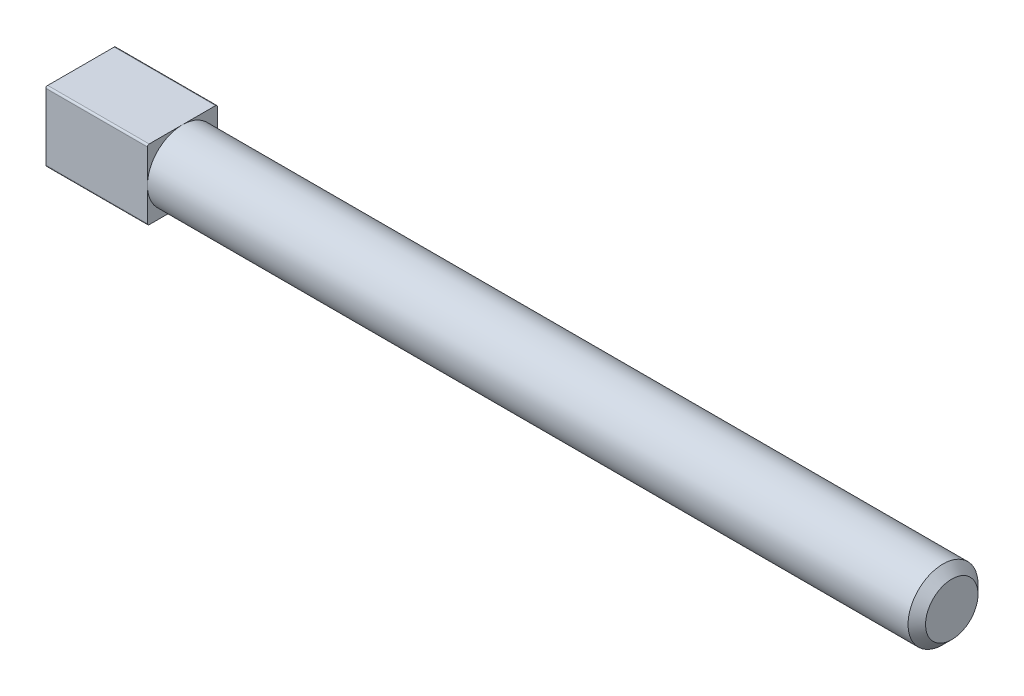
ISO-10303-21;
HEADER;
FILE_DESCRIPTION(('STEP AP214'),'2;1');
FILE_NAME('part.step','',(''),(''),'','','');
FILE_SCHEMA(('AUTOMOTIVE_DESIGN { 1 0 10303 214 1 1 1 1 }'));
ENDSEC;
DATA;
#1=APPLICATION_CONTEXT('core data for automotive mechanical design processes');
#2=APPLICATION_PROTOCOL_DEFINITION('international standard','automotive_design',2000,#1);
#3=PRODUCT_CONTEXT('',#1,'mechanical');
#4=PRODUCT('Part','Part','',(#3));
#5=PRODUCT_RELATED_PRODUCT_CATEGORY('part','',(#4));
#6=PRODUCT_DEFINITION_FORMATION('','',#4);
#7=PRODUCT_DEFINITION_CONTEXT('part definition',#1,'design');
#8=PRODUCT_DEFINITION('design','',#6,#7);
#9=PRODUCT_DEFINITION_SHAPE('','',#8);
#10=(LENGTH_UNIT() NAMED_UNIT(*) SI_UNIT(.MILLI.,.METRE.));
#11=(NAMED_UNIT(*) PLANE_ANGLE_UNIT() SI_UNIT($,.RADIAN.));
#12=(NAMED_UNIT(*) SI_UNIT($,.STERADIAN.) SOLID_ANGLE_UNIT());
#13=UNCERTAINTY_MEASURE_WITH_UNIT(LENGTH_MEASURE(1.E-05),#10,'distance_accuracy_value','');
#14=(GEOMETRIC_REPRESENTATION_CONTEXT(3) GLOBAL_UNCERTAINTY_ASSIGNED_CONTEXT((#13)) GLOBAL_UNIT_ASSIGNED_CONTEXT((#10,
#11,#12)) REPRESENTATION_CONTEXT('',''));
#15=CARTESIAN_POINT('',(0.,0.,0.));
#16=DIRECTION('',(0.,0.,1.));
#17=DIRECTION('',(1.,0.,0.));
#18=AXIS2_PLACEMENT_3D('',#15,#16,#17);
#19=CARTESIAN_POINT('',(6.,0.,0.));
#20=DIRECTION('',(-1.,0.,0.));
#21=DIRECTION('',(0.,0.,1.));
#22=AXIS2_PLACEMENT_3D('',#19,#20,#21);
#23=PLANE('',#22);
#24=DIRECTION('',(0.,1.,0.));
#25=VECTOR('',#24,1.);
#26=CARTESIAN_POINT('',(6.,-2.,-2.));
#27=LINE('',#26,#25);
#28=CARTESIAN_POINT('',(6.,0.,-2.));
#29=VERTEX_POINT('',#28);
#30=CARTESIAN_POINT('',(6.,1.9,-2.));
#31=VERTEX_POINT('',#30);
#32=EDGE_CURVE('E149',#29,#31,#27,.T.);
#33=ORIENTED_EDGE('',*,*,#32,.T.);
#34=CARTESIAN_POINT('',(6.,1.9,-1.9));
#35=DIRECTION('',(-1.,0.,0.));
#36=DIRECTION('',(0.,0.,1.));
#37=AXIS2_PLACEMENT_3D('',#34,#35,#36);
#38=CIRCLE('',#37,0.1);
#39=CARTESIAN_POINT('',(6.,2.,-1.9));
#40=VERTEX_POINT('',#39);
#41=EDGE_CURVE('E232',#31,#40,#38,.F.);
#42=ORIENTED_EDGE('',*,*,#41,.T.);
#43=DIRECTION('',(0.,0.,1.));
#44=VECTOR('',#43,1.);
#45=CARTESIAN_POINT('',(6.,2.,-2.));
#46=LINE('',#45,#44);
#47=CARTESIAN_POINT('',(6.,2.,0.));
#48=VERTEX_POINT('',#47);
#49=EDGE_CURVE('E163',#40,#48,#46,.T.);
#50=ORIENTED_EDGE('',*,*,#49,.T.);
#51=CARTESIAN_POINT('',(6.,0.,0.));
#52=DIRECTION('',(1.,0.,0.));
#53=DIRECTION('',(0.,0.,-1.));
#54=AXIS2_PLACEMENT_3D('',#51,#52,#53);
#55=CIRCLE('',#54,2.);
#56=EDGE_CURVE('E161',#29,#48,#55,.T.);
#57=ORIENTED_EDGE('',*,*,#56,.F.);
#58=EDGE_LOOP('',(#33,#42,#50,#57));
#59=FACE_BOUND('',#58,.T.);
#60=ADVANCED_FACE('F34',(#59),#23,.F.);
#61=CARTESIAN_POINT('',(6.,2.,1.9));
#62=VERTEX_POINT('',#61);
#63=EDGE_CURVE('E148',#48,#62,#46,.T.);
#64=ORIENTED_EDGE('',*,*,#63,.T.);
#65=CARTESIAN_POINT('',(6.,1.9,1.9));
#66=DIRECTION('',(-1.,0.,0.));
#67=DIRECTION('',(0.,0.,1.));
#68=AXIS2_PLACEMENT_3D('',#65,#66,#67);
#69=CIRCLE('',#68,0.1);
#70=CARTESIAN_POINT('',(6.,1.9,2.));
#71=VERTEX_POINT('',#70);
#72=EDGE_CURVE('E11',#62,#71,#69,.F.);
#73=ORIENTED_EDGE('',*,*,#72,.T.);
#74=DIRECTION('',(0.,-1.,0.));
#75=VECTOR('',#74,1.);
#76=CARTESIAN_POINT('',(6.,-2.,2.));
#77=LINE('',#76,#75);
#78=CARTESIAN_POINT('',(6.,0.,2.));
#79=VERTEX_POINT('',#78);
#80=EDGE_CURVE('E175',#71,#79,#77,.T.);
#81=ORIENTED_EDGE('',*,*,#80,.T.);
#82=EDGE_CURVE('E170',#48,#79,#55,.T.);
#83=ORIENTED_EDGE('',*,*,#82,.F.);
#84=EDGE_LOOP('',(#64,#73,#81,#83));
#85=FACE_BOUND('',#84,.T.);
#86=ADVANCED_FACE('F293',(#85),#23,.F.);
#87=CARTESIAN_POINT('',(6.,-1.9,2.));
#88=VERTEX_POINT('',#87);
#89=EDGE_CURVE('E176',#79,#88,#77,.T.);
#90=ORIENTED_EDGE('',*,*,#89,.T.);
#91=CARTESIAN_POINT('',(6.,-1.9,1.9));
#92=DIRECTION('',(-1.,0.,0.));
#93=DIRECTION('',(0.,0.,1.));
#94=AXIS2_PLACEMENT_3D('',#91,#92,#93);
#95=CIRCLE('',#94,0.1);
#96=CARTESIAN_POINT('',(6.,-2.,1.9));
#97=VERTEX_POINT('',#96);
#98=EDGE_CURVE('E42',#88,#97,#95,.F.);
#99=ORIENTED_EDGE('',*,*,#98,.T.);
#100=DIRECTION('',(0.,0.,-1.));
#101=VECTOR('',#100,1.);
#102=CARTESIAN_POINT('',(6.,-2.,-2.));
#103=LINE('',#102,#101);
#104=CARTESIAN_POINT('',(6.,-2.,0.));
#105=VERTEX_POINT('',#104);
#106=EDGE_CURVE('E159',#97,#105,#103,.T.);
#107=ORIENTED_EDGE('',*,*,#106,.T.);
#108=EDGE_CURVE('E174',#79,#105,#55,.T.);
#109=ORIENTED_EDGE('',*,*,#108,.F.);
#110=EDGE_LOOP('',(#90,#99,#107,#109));
#111=FACE_BOUND('',#110,.T.);
#112=ADVANCED_FACE('F254',(#111),#23,.F.);
#113=CARTESIAN_POINT('',(6.,-2.,-1.9));
#114=VERTEX_POINT('',#113);
#115=EDGE_CURVE('E167',#105,#114,#103,.T.);
#116=ORIENTED_EDGE('',*,*,#115,.T.);
#117=CARTESIAN_POINT('',(6.,-1.9,-1.9));
#118=DIRECTION('',(-1.,0.,0.));
#119=DIRECTION('',(0.,0.,1.));
#120=AXIS2_PLACEMENT_3D('',#117,#118,#119);
#121=CIRCLE('',#120,0.1);
#122=CARTESIAN_POINT('',(6.,-1.9,-2.));
#123=VERTEX_POINT('',#122);
#124=EDGE_CURVE('E144',#114,#123,#121,.F.);
#125=ORIENTED_EDGE('',*,*,#124,.T.);
#126=EDGE_CURVE('E136',#123,#29,#27,.T.);
#127=ORIENTED_EDGE('',*,*,#126,.T.);
#128=EDGE_CURVE('E141',#105,#29,#55,.T.);
#129=ORIENTED_EDGE('',*,*,#128,.F.);
#130=EDGE_LOOP('',(#116,#125,#127,#129));
#131=FACE_BOUND('',#130,.T.);
#132=ADVANCED_FACE('F139',(#131),#23,.F.);
#133=CARTESIAN_POINT('',(6.,-2.,-2.));
#134=DIRECTION('',(0.,1.,0.));
#135=DIRECTION('',(0.,0.,1.));
#136=AXIS2_PLACEMENT_3D('',#133,#134,#135);
#137=PLANE('',#136);
#138=DIRECTION('',(0.,0.,-1.));
#139=VECTOR('',#138,1.);
#140=CARTESIAN_POINT('',(0.199999999999999,-2.,-2.));
#141=LINE('',#140,#139);
#142=CARTESIAN_POINT('',(0.199999999999999,-2.,1.9));
#143=VERTEX_POINT('',#142);
#144=CARTESIAN_POINT('',(0.199999999999999,-2.,-1.9));
#145=VERTEX_POINT('',#144);
#146=EDGE_CURVE('E204',#143,#145,#141,.T.);
#147=ORIENTED_EDGE('',*,*,#146,.T.);
#148=DIRECTION('',(-1.,0.,0.));
#149=VECTOR('',#148,1.);
#150=CARTESIAN_POINT('',(6.,-2.,-1.9));
#151=LINE('',#150,#149);
#152=EDGE_CURVE('E241',#145,#114,#151,.F.);
#153=ORIENTED_EDGE('',*,*,#152,.T.);
#154=ORIENTED_EDGE('',*,*,#115,.F.);
#155=ORIENTED_EDGE('',*,*,#106,.F.);
#156=DIRECTION('',(-1.,0.,0.));
#157=VECTOR('',#156,1.);
#158=CARTESIAN_POINT('',(6.,-2.,1.9));
#159=LINE('',#158,#157);
#160=EDGE_CURVE('E238',#97,#143,#159,.T.);
#161=ORIENTED_EDGE('',*,*,#160,.T.);
#162=EDGE_LOOP('',(#147,#153,#154,#155,#161));
#163=FACE_BOUND('',#162,.T.);
#164=ADVANCED_FACE('F258',(#163),#137,.F.);
#165=CARTESIAN_POINT('',(6.,-2.,-2.));
#166=DIRECTION('',(0.,0.,1.));
#167=DIRECTION('',(0.,-1.,0.));
#168=AXIS2_PLACEMENT_3D('',#165,#166,#167);
#169=PLANE('',#168);
#170=DIRECTION('',(0.,1.,0.));
#171=VECTOR('',#170,1.);
#172=CARTESIAN_POINT('',(0.199999999999999,2.,-2.));
#173=LINE('',#172,#171);
#174=CARTESIAN_POINT('',(0.199999999999999,-1.9,-2.));
#175=VERTEX_POINT('',#174);
#176=CARTESIAN_POINT('',(0.199999999999999,1.9,-2.));
#177=VERTEX_POINT('',#176);
#178=EDGE_CURVE('E187',#175,#177,#173,.T.);
#179=ORIENTED_EDGE('',*,*,#178,.T.);
#180=DIRECTION('',(-1.,0.,0.));
#181=VECTOR('',#180,1.);
#182=CARTESIAN_POINT('',(6.,1.9,-2.));
#183=LINE('',#182,#181);
#184=EDGE_CURVE('E156',#177,#31,#183,.F.);
#185=ORIENTED_EDGE('',*,*,#184,.T.);
#186=ORIENTED_EDGE('',*,*,#32,.F.);
#187=ORIENTED_EDGE('',*,*,#126,.F.);
#188=DIRECTION('',(-1.,0.,0.));
#189=VECTOR('',#188,1.);
#190=CARTESIAN_POINT('',(6.,-1.9,-2.));
#191=LINE('',#190,#189);
#192=EDGE_CURVE('E229',#123,#175,#191,.T.);
#193=ORIENTED_EDGE('',*,*,#192,.T.);
#194=EDGE_LOOP('',(#179,#185,#186,#187,#193));
#195=FACE_BOUND('',#194,.T.);
#196=ADVANCED_FACE('F154',(#195),#169,.F.);
#197=CARTESIAN_POINT('',(6.,2.,-2.));
#198=DIRECTION('',(0.,-1.,0.));
#199=DIRECTION('',(0.,0.,-1.));
#200=AXIS2_PLACEMENT_3D('',#197,#198,#199);
#201=PLANE('',#200);
#202=ORIENTED_EDGE('',*,*,#49,.F.);
#203=DIRECTION('',(-1.,0.,0.));
#204=VECTOR('',#203,1.);
#205=CARTESIAN_POINT('',(6.,2.,-1.9));
#206=LINE('',#205,#204);
#207=CARTESIAN_POINT('',(0.199999999999999,2.,-1.9));
#208=VERTEX_POINT('',#207);
#209=EDGE_CURVE('E218',#40,#208,#206,.T.);
#210=ORIENTED_EDGE('',*,*,#209,.T.);
#211=DIRECTION('',(0.,0.,1.));
#212=VECTOR('',#211,1.);
#213=CARTESIAN_POINT('',(0.199999999999999,2.,2.));
#214=LINE('',#213,#212);
#215=CARTESIAN_POINT('',(0.199999999999999,2.,1.9));
#216=VERTEX_POINT('',#215);
#217=EDGE_CURVE('E199',#208,#216,#214,.T.);
#218=ORIENTED_EDGE('',*,*,#217,.T.);
#219=DIRECTION('',(-1.,0.,0.));
#220=VECTOR('',#219,1.);
#221=CARTESIAN_POINT('',(6.,2.,1.9));
#222=LINE('',#221,#220);
#223=EDGE_CURVE('E207',#216,#62,#222,.F.);
#224=ORIENTED_EDGE('',*,*,#223,.T.);
#225=ORIENTED_EDGE('',*,*,#63,.F.);
#226=EDGE_LOOP('',(#202,#210,#218,#224,#225));
#227=FACE_BOUND('',#226,.T.);
#228=ADVANCED_FACE('F290',(#227),#201,.F.);
#229=CARTESIAN_POINT('',(6.,-2.,2.));
#230=DIRECTION('',(0.,0.,-1.));
#231=DIRECTION('',(-1.,0.,0.));
#232=AXIS2_PLACEMENT_3D('',#229,#230,#231);
#233=PLANE('',#232);
#234=DIRECTION('',(0.,-1.,0.));
#235=VECTOR('',#234,1.);
#236=CARTESIAN_POINT('',(0.199999999999999,-2.,2.));
#237=LINE('',#236,#235);
#238=CARTESIAN_POINT('',(0.199999999999999,1.9,2.));
#239=VERTEX_POINT('',#238);
#240=CARTESIAN_POINT('',(0.199999999999999,-1.9,2.));
#241=VERTEX_POINT('',#240);
#242=EDGE_CURVE('E202',#239,#241,#237,.T.);
#243=ORIENTED_EDGE('',*,*,#242,.T.);
#244=DIRECTION('',(-1.,0.,0.));
#245=VECTOR('',#244,1.);
#246=CARTESIAN_POINT('',(6.,-1.9,2.));
#247=LINE('',#246,#245);
#248=EDGE_CURVE('E55',#241,#88,#247,.F.);
#249=ORIENTED_EDGE('',*,*,#248,.T.);
#250=ORIENTED_EDGE('',*,*,#89,.F.);
#251=ORIENTED_EDGE('',*,*,#80,.F.);
#252=DIRECTION('',(-1.,0.,0.));
#253=VECTOR('',#252,1.);
#254=CARTESIAN_POINT('',(6.,1.9,2.));
#255=LINE('',#254,#253);
#256=EDGE_CURVE('E248',#71,#239,#255,.T.);
#257=ORIENTED_EDGE('',*,*,#256,.T.);
#258=EDGE_LOOP('',(#243,#249,#250,#251,#257));
#259=FACE_BOUND('',#258,.T.);
#260=ADVANCED_FACE('F297',(#259),#233,.F.);
#261=CARTESIAN_POINT('',(0.,0.,0.));
#262=DIRECTION('',(-1.,0.,0.));
#263=DIRECTION('',(0.,0.,1.));
#264=AXIS2_PLACEMENT_3D('',#261,#262,#263);
#265=PLANE('',#264);
#266=DIRECTION('',(0.,0.,-1.));
#267=VECTOR('',#266,1.);
#268=CARTESIAN_POINT('',(0.,1.8,-2.));
#269=LINE('',#268,#267);
#270=CARTESIAN_POINT('',(0.,1.8,1.8));
#271=VERTEX_POINT('',#270);
#272=CARTESIAN_POINT('',(0.,1.8,-1.8));
#273=VERTEX_POINT('',#272);
#274=EDGE_CURVE('E194',#271,#273,#269,.T.);
#275=ORIENTED_EDGE('',*,*,#274,.T.);
#276=DIRECTION('',(0.,-1.,0.));
#277=VECTOR('',#276,1.);
#278=CARTESIAN_POINT('',(0.,-2.,-1.8));
#279=LINE('',#278,#277);
#280=CARTESIAN_POINT('',(0.,-1.8,-1.8));
#281=VERTEX_POINT('',#280);
#282=EDGE_CURVE('E196',#273,#281,#279,.T.);
#283=ORIENTED_EDGE('',*,*,#282,.T.);
#284=DIRECTION('',(0.,0.,1.));
#285=VECTOR('',#284,1.);
#286=CARTESIAN_POINT('',(0.,-1.8,2.));
#287=LINE('',#286,#285);
#288=CARTESIAN_POINT('',(0.,-1.8,1.8));
#289=VERTEX_POINT('',#288);
#290=EDGE_CURVE('E189',#281,#289,#287,.T.);
#291=ORIENTED_EDGE('',*,*,#290,.T.);
#292=DIRECTION('',(0.,1.,0.));
#293=VECTOR('',#292,1.);
#294=CARTESIAN_POINT('',(0.,2.,1.8));
#295=LINE('',#294,#293);
#296=EDGE_CURVE('E192',#289,#271,#295,.T.);
#297=ORIENTED_EDGE('',*,*,#296,.T.);
#298=EDGE_LOOP('',(#275,#283,#291,#297));
#299=FACE_BOUND('',#298,.T.);
#300=ADVANCED_FACE('F274',(#299),#265,.T.);
#301=CARTESIAN_POINT('',(50.,0.,0.));
#302=DIRECTION('',(-1.,0.,0.));
#303=DIRECTION('',(0.,0.,1.));
#304=AXIS2_PLACEMENT_3D('',#301,#302,#303);
#305=CYLINDRICAL_SURFACE('',#304,2.);
#306=CARTESIAN_POINT('',(49.5,0.,0.));
#307=DIRECTION('',(1.,0.,0.));
#308=DIRECTION('',(0.,0.,-1.));
#309=AXIS2_PLACEMENT_3D('',#306,#307,#308);
#310=CIRCLE('',#309,2.);
#311=CARTESIAN_POINT('',(49.5,0.,-2.));
#312=VERTEX_POINT('',#311);
#313=EDGE_CURVE('E184',#312,#312,#310,.F.);
#314=ORIENTED_EDGE('',*,*,#313,.T.);
#315=EDGE_LOOP('',(#314));
#316=FACE_BOUND('',#315,.T.);
#317=ORIENTED_EDGE('',*,*,#56,.T.);
#318=ORIENTED_EDGE('',*,*,#82,.T.);
#319=ORIENTED_EDGE('',*,*,#108,.T.);
#320=ORIENTED_EDGE('',*,*,#128,.T.);
#321=EDGE_LOOP('',(#317,#318,#319,#320));
#322=FACE_BOUND('',#321,.T.);
#323=ADVANCED_FACE('F172',(#316,#322),#305,.T.);
#324=CARTESIAN_POINT('',(50.,0.,0.));
#325=DIRECTION('',(1.,0.,0.));
#326=DIRECTION('',(0.,0.,-1.));
#327=AXIS2_PLACEMENT_3D('',#324,#325,#326);
#328=PLANE('',#327);
#329=CARTESIAN_POINT('',(50.,0.,0.));
#330=DIRECTION('',(1.,0.,0.));
#331=DIRECTION('',(0.,0.,-1.));
#332=AXIS2_PLACEMENT_3D('',#329,#330,#331);
#333=CIRCLE('',#332,1.5);
#334=CARTESIAN_POINT('',(50.,0.,-1.5));
#335=VERTEX_POINT('',#334);
#336=EDGE_CURVE('E181',#335,#335,#333,.T.);
#337=ORIENTED_EDGE('',*,*,#336,.T.);
#338=EDGE_LOOP('',(#337));
#339=FACE_BOUND('',#338,.T.);
#340=ADVANCED_FACE('F353',(#339),#328,.T.);
#341=CARTESIAN_POINT('',(50.,0.,0.));
#342=DIRECTION('',(-1.,0.,0.));
#343=DIRECTION('',(0.,0.,1.));
#344=AXIS2_PLACEMENT_3D('',#341,#342,#343);
#345=CONICAL_SURFACE('',#344,1.5,0.785398163397452);
#346=ORIENTED_EDGE('',*,*,#313,.F.);
#347=EDGE_LOOP('',(#346));
#348=FACE_BOUND('',#347,.T.);
#349=ORIENTED_EDGE('',*,*,#336,.F.);
#350=EDGE_LOOP('',(#349));
#351=FACE_BOUND('',#350,.T.);
#352=ADVANCED_FACE('F348',(#348,#351),#345,.T.);
#353=CARTESIAN_POINT('',(0.199999999999999,-2.,2.));
#354=DIRECTION('',(-0.707106781186548,0.,0.707106781186548));
#355=DIRECTION('',(0.,1.,0.));
#356=AXIS2_PLACEMENT_3D('',#353,#354,#355);
#357=PLANE('',#356);
#358=DIRECTION('',(-0.577350269189626,0.577350269189626,-0.577350269189626));
#359=VECTOR('',#358,1.);
#360=CARTESIAN_POINT('',(-1.13333333333333,-0.666666666666668,0.666666666666667));
#361=LINE('',#360,#359);
#362=CARTESIAN_POINT('',(0.170710678118653,-1.97071067811866,1.97071067811865));
#363=VERTEX_POINT('',#362);
#364=EDGE_CURVE('E168',#363,#289,#361,.T.);
#365=ORIENTED_EDGE('',*,*,#364,.F.);
#366=CARTESIAN_POINT('',(0.0999999999999985,-1.9,1.9));
#367=DIRECTION('',(-0.707106781186548,0.,0.707106781186548));
#368=DIRECTION('',(-0.707106781186548,0.,-0.707106781186548));
#369=AXIS2_PLACEMENT_3D('',#366,#367,#368);
#370=ELLIPSE('',#369,0.14142135623731,0.1);
#371=EDGE_CURVE('E246',#363,#241,#370,.T.);
#372=ORIENTED_EDGE('',*,*,#371,.T.);
#373=ORIENTED_EDGE('',*,*,#242,.F.);
#374=CARTESIAN_POINT('',(0.0999999999999985,1.9,1.9));
#375=DIRECTION('',(-0.707106781186548,0.,0.707106781186548));
#376=DIRECTION('',(-0.707106781186548,0.,-0.707106781186548));
#377=AXIS2_PLACEMENT_3D('',#374,#375,#376);
#378=ELLIPSE('',#377,0.14142135623731,0.1);
#379=CARTESIAN_POINT('',(0.170710678118653,1.97071067811865,1.97071067811865));
#380=VERTEX_POINT('',#379);
#381=EDGE_CURVE('E244',#239,#380,#378,.T.);
#382=ORIENTED_EDGE('',*,*,#381,.T.);
#383=DIRECTION('',(-0.577350269189626,-0.577350269189626,-0.577350269189626));
#384=VECTOR('',#383,1.);
#385=CARTESIAN_POINT('',(-1.13333333333333,0.666666666666665,0.666666666666667));
#386=LINE('',#385,#384);
#387=EDGE_CURVE('E213',#271,#380,#386,.F.);
#388=ORIENTED_EDGE('',*,*,#387,.F.);
#389=ORIENTED_EDGE('',*,*,#296,.F.);
#390=EDGE_LOOP('',(#365,#372,#373,#382,#388,#389));
#391=FACE_BOUND('',#390,.T.);
#392=ADVANCED_FACE('F269',(#391),#357,.T.);
#393=CARTESIAN_POINT('',(0.199999999999999,-2.,-2.));
#394=DIRECTION('',(-0.707106781186548,-0.707106781186548,0.));
#395=DIRECTION('',(0.,0.,1.));
#396=AXIS2_PLACEMENT_3D('',#393,#394,#395);
#397=PLANE('',#396);
#398=DIRECTION('',(0.577350269189626,-0.577350269189626,-0.577350269189626));
#399=VECTOR('',#398,1.);
#400=CARTESIAN_POINT('',(0.199999999999999,-2.,-2.));
#401=LINE('',#400,#399);
#402=CARTESIAN_POINT('',(0.170710678118653,-1.97071067811866,-1.97071067811865));
#403=VERTEX_POINT('',#402);
#404=EDGE_CURVE('E211',#403,#281,#401,.F.);
#405=ORIENTED_EDGE('',*,*,#404,.F.);
#406=CARTESIAN_POINT('',(0.0999999999999985,-1.9,-1.9));
#407=DIRECTION('',(-0.707106781186548,-0.707106781186548,0.));
#408=DIRECTION('',(-0.707106781186548,0.707106781186548,0.));
#409=AXIS2_PLACEMENT_3D('',#406,#407,#408);
#410=ELLIPSE('',#409,0.14142135623731,0.1);
#411=EDGE_CURVE('E236',#403,#145,#410,.T.);
#412=ORIENTED_EDGE('',*,*,#411,.T.);
#413=ORIENTED_EDGE('',*,*,#146,.F.);
#414=CARTESIAN_POINT('',(0.0999999999999985,-1.9,1.9));
#415=DIRECTION('',(-0.707106781186548,-0.707106781186548,0.));
#416=DIRECTION('',(-0.707106781186548,0.707106781186548,0.));
#417=AXIS2_PLACEMENT_3D('',#414,#415,#416);
#418=ELLIPSE('',#417,0.14142135623731,0.1);
#419=EDGE_CURVE('E234',#143,#363,#418,.T.);
#420=ORIENTED_EDGE('',*,*,#419,.T.);
#421=ORIENTED_EDGE('',*,*,#364,.T.);
#422=ORIENTED_EDGE('',*,*,#290,.F.);
#423=EDGE_LOOP('',(#405,#412,#413,#420,#421,#422));
#424=FACE_BOUND('',#423,.T.);
#425=ADVANCED_FACE('F265',(#424),#397,.T.);
#426=CARTESIAN_POINT('',(0.199999999999999,2.,-2.));
#427=DIRECTION('',(-0.707106781186548,0.707106781186548,0.));
#428=DIRECTION('',(0.,0.,-1.));
#429=AXIS2_PLACEMENT_3D('',#426,#427,#428);
#430=PLANE('',#429);
#431=ORIENTED_EDGE('',*,*,#217,.F.);
#432=CARTESIAN_POINT('',(0.0999999999999985,1.9,-1.9));
#433=DIRECTION('',(-0.707106781186548,0.707106781186548,0.));
#434=DIRECTION('',(-0.707106781186548,-0.707106781186548,0.));
#435=AXIS2_PLACEMENT_3D('',#432,#433,#434);
#436=ELLIPSE('',#435,0.14142135623731,0.1);
#437=CARTESIAN_POINT('',(0.170710678118653,1.97071067811865,-1.97071067811865));
#438=VERTEX_POINT('',#437);
#439=EDGE_CURVE('E223',#208,#438,#436,.T.);
#440=ORIENTED_EDGE('',*,*,#439,.T.);
#441=DIRECTION('',(-0.577350269189626,-0.577350269189626,0.577350269189626));
#442=VECTOR('',#441,1.);
#443=CARTESIAN_POINT('',(0.199999999999999,2.,-2.));
#444=LINE('',#443,#442);
#445=EDGE_CURVE('E208',#273,#438,#444,.F.);
#446=ORIENTED_EDGE('',*,*,#445,.F.);
#447=ORIENTED_EDGE('',*,*,#274,.F.);
#448=ORIENTED_EDGE('',*,*,#387,.T.);
#449=CARTESIAN_POINT('',(0.0999999999999985,1.9,1.9));
#450=DIRECTION('',(-0.707106781186548,0.707106781186548,0.));
#451=DIRECTION('',(-0.707106781186548,-0.707106781186548,0.));
#452=AXIS2_PLACEMENT_3D('',#449,#450,#451);
#453=ELLIPSE('',#452,0.14142135623731,0.1);
#454=EDGE_CURVE('E221',#380,#216,#453,.T.);
#455=ORIENTED_EDGE('',*,*,#454,.T.);
#456=EDGE_LOOP('',(#431,#440,#446,#447,#448,#455));
#457=FACE_BOUND('',#456,.T.);
#458=ADVANCED_FACE('F299',(#457),#430,.T.);
#459=CARTESIAN_POINT('',(0.199999999999999,-2.,-2.));
#460=DIRECTION('',(-0.707106781186548,0.,-0.707106781186548));
#461=DIRECTION('',(0.,-1.,0.));
#462=AXIS2_PLACEMENT_3D('',#459,#460,#461);
#463=PLANE('',#462);
#464=ORIENTED_EDGE('',*,*,#445,.T.);
#465=CARTESIAN_POINT('',(0.0999999999999985,1.9,-1.9));
#466=DIRECTION('',(-0.707106781186548,0.,-0.707106781186548));
#467=DIRECTION('',(-0.707106781186548,0.,0.707106781186548));
#468=AXIS2_PLACEMENT_3D('',#465,#466,#467);
#469=ELLIPSE('',#468,0.14142135623731,0.1);
#470=EDGE_CURVE('E227',#438,#177,#469,.T.);
#471=ORIENTED_EDGE('',*,*,#470,.T.);
#472=ORIENTED_EDGE('',*,*,#178,.F.);
#473=CARTESIAN_POINT('',(0.0999999999999985,-1.9,-1.9));
#474=DIRECTION('',(-0.707106781186548,0.,-0.707106781186548));
#475=DIRECTION('',(-0.707106781186548,0.,0.707106781186548));
#476=AXIS2_PLACEMENT_3D('',#473,#474,#475);
#477=ELLIPSE('',#476,0.14142135623731,0.1);
#478=EDGE_CURVE('E225',#175,#403,#477,.T.);
#479=ORIENTED_EDGE('',*,*,#478,.T.);
#480=ORIENTED_EDGE('',*,*,#404,.T.);
#481=ORIENTED_EDGE('',*,*,#282,.F.);
#482=EDGE_LOOP('',(#464,#471,#472,#479,#480,#481));
#483=FACE_BOUND('',#482,.T.);
#484=ADVANCED_FACE('F282',(#483),#463,.T.);
#485=CARTESIAN_POINT('',(6.,1.9,-1.9));
#486=DIRECTION('',(-1.,0.,0.));
#487=DIRECTION('',(0.,0.,1.));
#488=AXIS2_PLACEMENT_3D('',#485,#486,#487);
#489=CYLINDRICAL_SURFACE('',#488,0.1);
#490=ORIENTED_EDGE('',*,*,#41,.F.);
#491=ORIENTED_EDGE('',*,*,#184,.F.);
#492=ORIENTED_EDGE('',*,*,#470,.F.);
#493=ORIENTED_EDGE('',*,*,#439,.F.);
#494=ORIENTED_EDGE('',*,*,#209,.F.);
#495=EDGE_LOOP('',(#490,#491,#492,#493,#494));
#496=FACE_BOUND('',#495,.T.);
#497=ADVANCED_FACE('F286',(#496),#489,.T.);
#498=CARTESIAN_POINT('',(6.,-1.9,-1.9));
#499=DIRECTION('',(-1.,0.,0.));
#500=DIRECTION('',(0.,0.,1.));
#501=AXIS2_PLACEMENT_3D('',#498,#499,#500);
#502=CYLINDRICAL_SURFACE('',#501,0.1);
#503=ORIENTED_EDGE('',*,*,#124,.F.);
#504=ORIENTED_EDGE('',*,*,#152,.F.);
#505=ORIENTED_EDGE('',*,*,#411,.F.);
#506=ORIENTED_EDGE('',*,*,#478,.F.);
#507=ORIENTED_EDGE('',*,*,#192,.F.);
#508=EDGE_LOOP('',(#503,#504,#505,#506,#507));
#509=FACE_BOUND('',#508,.T.);
#510=ADVANCED_FACE('F280',(#509),#502,.T.);
#511=CARTESIAN_POINT('',(6.,-1.9,1.9));
#512=DIRECTION('',(-1.,0.,0.));
#513=DIRECTION('',(0.,0.,1.));
#514=AXIS2_PLACEMENT_3D('',#511,#512,#513);
#515=CYLINDRICAL_SURFACE('',#514,0.1);
#516=ORIENTED_EDGE('',*,*,#98,.F.);
#517=ORIENTED_EDGE('',*,*,#248,.F.);
#518=ORIENTED_EDGE('',*,*,#371,.F.);
#519=ORIENTED_EDGE('',*,*,#419,.F.);
#520=ORIENTED_EDGE('',*,*,#160,.F.);
#521=EDGE_LOOP('',(#516,#517,#518,#519,#520));
#522=FACE_BOUND('',#521,.T.);
#523=ADVANCED_FACE('F260',(#522),#515,.T.);
#524=CARTESIAN_POINT('',(6.,1.9,1.9));
#525=DIRECTION('',(-1.,0.,0.));
#526=DIRECTION('',(0.,0.,1.));
#527=AXIS2_PLACEMENT_3D('',#524,#525,#526);
#528=CYLINDRICAL_SURFACE('',#527,0.1);
#529=ORIENTED_EDGE('',*,*,#72,.F.);
#530=ORIENTED_EDGE('',*,*,#223,.F.);
#531=ORIENTED_EDGE('',*,*,#454,.F.);
#532=ORIENTED_EDGE('',*,*,#381,.F.);
#533=ORIENTED_EDGE('',*,*,#256,.F.);
#534=EDGE_LOOP('',(#529,#530,#531,#532,#533));
#535=FACE_BOUND('',#534,.T.);
#536=ADVANCED_FACE('F36',(#535),#528,.T.);
#537=CLOSED_SHELL('',(#60,#86,#112,#132,#164,#196,#228,#260,#300,#323,#340,#352,#392,#425,#458,
#484,#497,#510,#523,#536));
#538=MANIFOLD_SOLID_BREP('B2',#537);
#539=ADVANCED_BREP_SHAPE_REPRESENTATION('',(#18,#538),#14);
#540=SHAPE_DEFINITION_REPRESENTATION(#9,#539);
ENDSEC;
END-ISO-10303-21;
